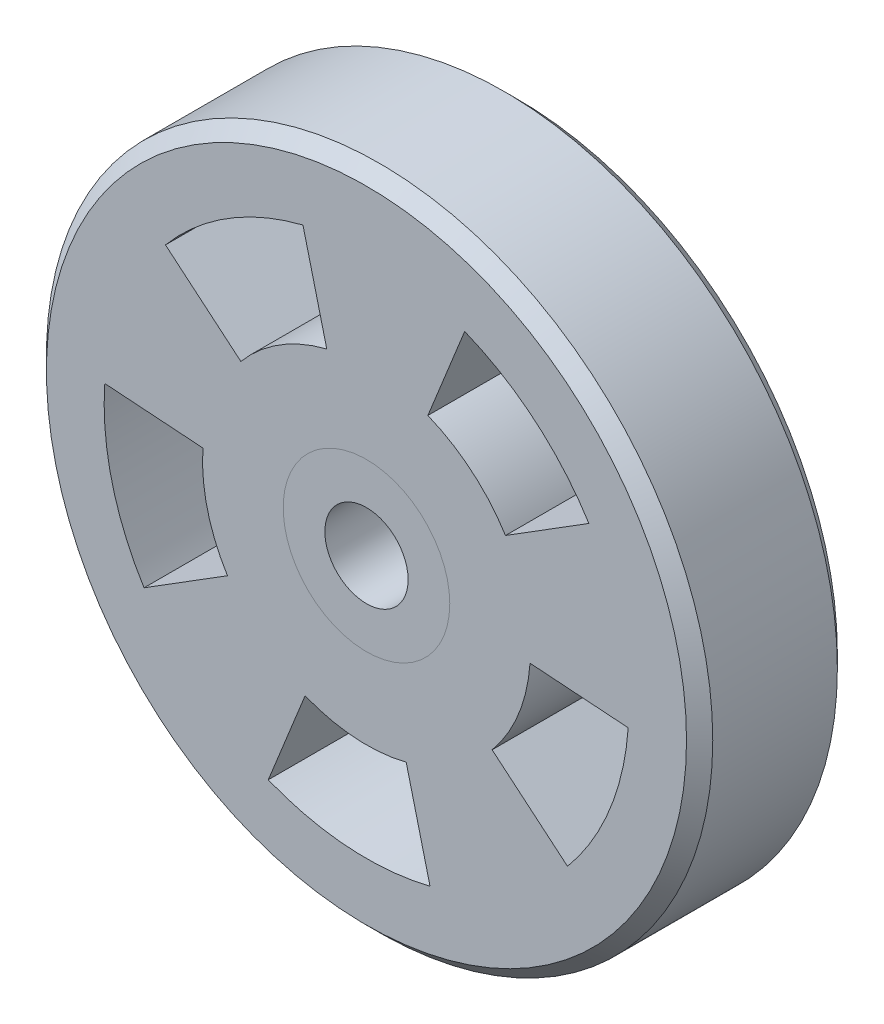
ISO-10303-21;
HEADER;
FILE_DESCRIPTION(('STEP AP214'),'2;1');
FILE_NAME('part.step','',(''),(''),'','','');
FILE_SCHEMA(('AUTOMOTIVE_DESIGN { 1 0 10303 214 1 1 1 1 }'));
ENDSEC;
DATA;
#1=APPLICATION_CONTEXT('core data for automotive mechanical design processes');
#2=APPLICATION_PROTOCOL_DEFINITION('international standard','automotive_design',2000,#1);
#3=PRODUCT_CONTEXT('',#1,'mechanical');
#4=PRODUCT('Part','Part','',(#3));
#5=PRODUCT_RELATED_PRODUCT_CATEGORY('part','',(#4));
#6=PRODUCT_DEFINITION_FORMATION('','',#4);
#7=PRODUCT_DEFINITION_CONTEXT('part definition',#1,'design');
#8=PRODUCT_DEFINITION('design','',#6,#7);
#9=PRODUCT_DEFINITION_SHAPE('','',#8);
#10=(LENGTH_UNIT() NAMED_UNIT(*) SI_UNIT(.MILLI.,.METRE.));
#11=(NAMED_UNIT(*) PLANE_ANGLE_UNIT() SI_UNIT($,.RADIAN.));
#12=(NAMED_UNIT(*) SI_UNIT($,.STERADIAN.) SOLID_ANGLE_UNIT());
#13=UNCERTAINTY_MEASURE_WITH_UNIT(LENGTH_MEASURE(1.E-05),#10,'distance_accuracy_value','');
#14=(GEOMETRIC_REPRESENTATION_CONTEXT(3) GLOBAL_UNCERTAINTY_ASSIGNED_CONTEXT((#13)) GLOBAL_UNIT_ASSIGNED_CONTEXT((#10,
#11,#12)) REPRESENTATION_CONTEXT('',''));
#15=CARTESIAN_POINT('',(0.,0.,0.));
#16=DIRECTION('',(0.,0.,1.));
#17=DIRECTION('',(1.,0.,0.));
#18=AXIS2_PLACEMENT_3D('',#15,#16,#17);
#19=CARTESIAN_POINT('',(0.,0.,-35.9210244842766));
#20=DIRECTION('',(0.,0.,1.));
#21=DIRECTION('',(1.,0.,0.));
#22=AXIS2_PLACEMENT_3D('',#19,#20,#21);
#23=CYLINDRICAL_SURFACE('',#22,12.7);
#24=CARTESIAN_POINT('',(0.,0.,0.));
#25=DIRECTION('',(0.,0.,1.));
#26=DIRECTION('',(1.,0.,0.));
#27=AXIS2_PLACEMENT_3D('',#24,#25,#26);
#28=CIRCLE('',#27,12.7);
#29=CARTESIAN_POINT('',(12.7,0.,0.));
#30=VERTEX_POINT('',#29);
#31=EDGE_CURVE('E11',#30,#30,#28,.F.);
#32=CARTESIAN_POINT('',(0.,0.,23.));
#33=DIRECTION('',(0.,0.,1.));
#34=DIRECTION('',(1.,0.,0.));
#35=AXIS2_PLACEMENT_3D('',#32,#33,#34);
#36=CIRCLE('',#35,12.7);
#37=CARTESIAN_POINT('',(12.7,0.,23.));
#38=VERTEX_POINT('',#37);
#39=EDGE_CURVE('E64',#38,#38,#36,.T.);
#40=CARTESIAN_POINT('',(12.7,0.,0.));
#41=CARTESIAN_POINT('',(12.7,0.,0.239583333333325));
#42=CARTESIAN_POINT('',(12.7,0.,0.479166666666658));
#43=CARTESIAN_POINT('',(12.7,0.,0.958333333333325));
#44=CARTESIAN_POINT('',(12.7,0.,1.19791666666666));
#45=CARTESIAN_POINT('',(12.7,0.,1.67708333333333));
#46=CARTESIAN_POINT('',(12.7,0.,1.91666666666666));
#47=CARTESIAN_POINT('',(12.7,0.,2.39583333333333));
#48=CARTESIAN_POINT('',(12.7,0.,2.63541666666666));
#49=CARTESIAN_POINT('',(12.7,0.,3.11458333333333));
#50=CARTESIAN_POINT('',(12.7,0.,3.35416666666666));
#51=CARTESIAN_POINT('',(12.7,0.,3.83333333333333));
#52=CARTESIAN_POINT('',(12.7,0.,4.07291666666666));
#53=CARTESIAN_POINT('',(12.7,0.,4.55208333333333));
#54=CARTESIAN_POINT('',(12.7,0.,4.79166666666666));
#55=CARTESIAN_POINT('',(12.7,0.,5.27083333333333));
#56=CARTESIAN_POINT('',(12.7,0.,5.51041666666666));
#57=CARTESIAN_POINT('',(12.7,0.,5.98958333333333));
#58=CARTESIAN_POINT('',(12.7,0.,6.22916666666666));
#59=CARTESIAN_POINT('',(12.7,0.,6.70833333333333));
#60=CARTESIAN_POINT('',(12.7,0.,6.94791666666666));
#61=CARTESIAN_POINT('',(12.7,0.,7.42708333333333));
#62=CARTESIAN_POINT('',(12.7,0.,7.66666666666666));
#63=CARTESIAN_POINT('',(12.7,0.,8.14583333333333));
#64=CARTESIAN_POINT('',(12.7,0.,8.38541666666666));
#65=CARTESIAN_POINT('',(12.7,0.,8.86458333333333));
#66=CARTESIAN_POINT('',(12.7,0.,9.10416666666666));
#67=CARTESIAN_POINT('',(12.7,0.,9.58333333333333));
#68=CARTESIAN_POINT('',(12.7,0.,9.82291666666666));
#69=CARTESIAN_POINT('',(12.7,0.,10.3020833333333));
#70=CARTESIAN_POINT('',(12.7,0.,10.5416666666667));
#71=CARTESIAN_POINT('',(12.7,0.,11.0208333333333));
#72=CARTESIAN_POINT('',(12.7,0.,11.2604166666667));
#73=CARTESIAN_POINT('',(12.7,0.,11.7395833333333));
#74=CARTESIAN_POINT('',(12.7,0.,11.9791666666667));
#75=CARTESIAN_POINT('',(12.7,0.,12.4583333333333));
#76=CARTESIAN_POINT('',(12.7,0.,12.6979166666667));
#77=CARTESIAN_POINT('',(12.7,0.,13.1770833333333));
#78=CARTESIAN_POINT('',(12.7,0.,13.4166666666667));
#79=CARTESIAN_POINT('',(12.7,0.,13.8958333333333));
#80=CARTESIAN_POINT('',(12.7,0.,14.1354166666667));
#81=CARTESIAN_POINT('',(12.7,0.,14.6145833333333));
#82=CARTESIAN_POINT('',(12.7,0.,14.8541666666667));
#83=CARTESIAN_POINT('',(12.7,0.,15.3333333333333));
#84=CARTESIAN_POINT('',(12.7,0.,15.5729166666667));
#85=CARTESIAN_POINT('',(12.7,0.,16.0520833333333));
#86=CARTESIAN_POINT('',(12.7,0.,16.2916666666667));
#87=CARTESIAN_POINT('',(12.7,0.,16.7708333333333));
#88=CARTESIAN_POINT('',(12.7,0.,17.0104166666667));
#89=CARTESIAN_POINT('',(12.7,0.,17.4895833333333));
#90=CARTESIAN_POINT('',(12.7,0.,17.7291666666667));
#91=CARTESIAN_POINT('',(12.7,0.,18.2083333333333));
#92=CARTESIAN_POINT('',(12.7,0.,18.4479166666667));
#93=CARTESIAN_POINT('',(12.7,0.,18.9270833333333));
#94=CARTESIAN_POINT('',(12.7,0.,19.1666666666667));
#95=CARTESIAN_POINT('',(12.7,0.,19.6458333333333));
#96=CARTESIAN_POINT('',(12.7,0.,19.8854166666667));
#97=CARTESIAN_POINT('',(12.7,0.,20.3645833333333));
#98=CARTESIAN_POINT('',(12.7,0.,20.6041666666667));
#99=CARTESIAN_POINT('',(12.7,0.,21.0833333333333));
#100=CARTESIAN_POINT('',(12.7,0.,21.3229166666667));
#101=CARTESIAN_POINT('',(12.7,0.,21.8020833333333));
#102=CARTESIAN_POINT('',(12.7,0.,22.0416666666667));
#103=CARTESIAN_POINT('',(12.7,0.,22.5208333333333));
#104=CARTESIAN_POINT('',(12.7,0.,22.7604166666667));
#105=CARTESIAN_POINT('',(12.7,0.,23.));
#106=B_SPLINE_CURVE_WITH_KNOTS('',3,(#40,#41,#42,#43,#44,#45,#46,#47,#48,#49,#50,#51,#52,#53,
#54,#55,#56,#57,#58,#59,#60,#61,#62,#63,#64,#65,#66,#67,#68,#69,#70,#71,#72,#73,#74,#75,#76,#77,
#78,#79,#80,#81,#82,#83,#84,#85,#86,#87,#88,#89,#90,#91,#92,#93,#94,#95,#96,#97,#98,#99,#100,
#101,#102,#103,#104,#105),.UNSPECIFIED.,.F.,.F.,(4,2,2,2,2,2,2,2,2,2,2,2,2,2,2,2,2,2,2,2,2,2,2,
2,2,2,2,2,2,2,2,2,4),(0.,0.718749999999997,1.4375,2.15625,2.875,3.59375,4.3125,5.03125,
5.75000000000001,6.46875,7.1875,7.90625,8.625,9.34375000000001,10.0625,10.78125,11.5,12.21875,
12.9375,13.65625,14.375,15.09375,15.8125,16.53125,17.25,17.96875,18.6875,19.40625,20.125,
20.84375,21.5625,22.28125,23.),.UNSPECIFIED.);
#107=EDGE_CURVE('BSEAM53',#30,#38,#106,.T.);
#108=ORIENTED_EDGE('',*,*,#31,.F.);
#109=ORIENTED_EDGE('',*,*,#39,.F.);
#110=ORIENTED_EDGE('',*,*,#107,.T.);
#111=ORIENTED_EDGE('',*,*,#107,.F.);
#112=EDGE_LOOP('',(#108,#110,#109,#111));
#113=FACE_BOUND('',#112,.T.);
#114=ADVANCED_FACE('F53',(#113),#23,.T.);
#115=CARTESIAN_POINT('',(0.,0.,23.));
#116=DIRECTION('',(0.,0.,1.));
#117=DIRECTION('',(1.,0.,0.));
#118=AXIS2_PLACEMENT_3D('',#115,#116,#117);
#119=PLANE('',#118);
#120=CARTESIAN_POINT('',(0.,0.,23.));
#121=DIRECTION('',(0.,0.,1.));
#122=DIRECTION('',(1.,0.,0.));
#123=AXIS2_PLACEMENT_3D('',#120,#121,#122);
#124=CIRCLE('',#123,6.35);
#125=CARTESIAN_POINT('',(6.35,0.,23.));
#126=VERTEX_POINT('',#125);
#127=EDGE_CURVE('E66',#126,#126,#124,.T.);
#128=ORIENTED_EDGE('',*,*,#127,.F.);
#129=EDGE_LOOP('',(#128));
#130=FACE_BOUND('',#129,.T.);
#131=ORIENTED_EDGE('',*,*,#39,.T.);
#132=EDGE_LOOP('',(#131));
#133=FACE_BOUND('',#132,.T.);
#134=ADVANCED_FACE('F71',(#130,#133),#119,.T.);
#135=CARTESIAN_POINT('',(0.,0.,-35.9210244842766));
#136=DIRECTION('',(0.,0.,1.));
#137=DIRECTION('',(1.,0.,0.));
#138=AXIS2_PLACEMENT_3D('',#135,#136,#137);
#139=CYLINDRICAL_SURFACE('',#138,6.35);
#140=CARTESIAN_POINT('',(0.,0.,0.));
#141=DIRECTION('',(0.,0.,1.));
#142=DIRECTION('',(1.,0.,0.));
#143=AXIS2_PLACEMENT_3D('',#140,#141,#142);
#144=CIRCLE('',#143,6.35);
#145=CARTESIAN_POINT('',(6.35,0.,0.));
#146=VERTEX_POINT('',#145);
#147=EDGE_CURVE('E56',#146,#146,#144,.F.);
#148=CARTESIAN_POINT('',(6.35,0.,0.));
#149=CARTESIAN_POINT('',(6.35,0.,0.239583333333325));
#150=CARTESIAN_POINT('',(6.35,0.,0.479166666666658));
#151=CARTESIAN_POINT('',(6.35,0.,0.958333333333325));
#152=CARTESIAN_POINT('',(6.35,0.,1.19791666666666));
#153=CARTESIAN_POINT('',(6.35,0.,1.67708333333333));
#154=CARTESIAN_POINT('',(6.35,0.,1.91666666666666));
#155=CARTESIAN_POINT('',(6.35,0.,2.39583333333333));
#156=CARTESIAN_POINT('',(6.35,0.,2.63541666666666));
#157=CARTESIAN_POINT('',(6.35,0.,3.11458333333333));
#158=CARTESIAN_POINT('',(6.35,0.,3.35416666666666));
#159=CARTESIAN_POINT('',(6.35,0.,3.83333333333333));
#160=CARTESIAN_POINT('',(6.35,0.,4.07291666666666));
#161=CARTESIAN_POINT('',(6.35,0.,4.55208333333333));
#162=CARTESIAN_POINT('',(6.35,0.,4.79166666666666));
#163=CARTESIAN_POINT('',(6.35,0.,5.27083333333333));
#164=CARTESIAN_POINT('',(6.35,0.,5.51041666666666));
#165=CARTESIAN_POINT('',(6.35,0.,5.98958333333333));
#166=CARTESIAN_POINT('',(6.35,0.,6.22916666666666));
#167=CARTESIAN_POINT('',(6.35,0.,6.70833333333333));
#168=CARTESIAN_POINT('',(6.35,0.,6.94791666666666));
#169=CARTESIAN_POINT('',(6.35,0.,7.42708333333333));
#170=CARTESIAN_POINT('',(6.35,0.,7.66666666666666));
#171=CARTESIAN_POINT('',(6.35,0.,8.14583333333333));
#172=CARTESIAN_POINT('',(6.35,0.,8.38541666666666));
#173=CARTESIAN_POINT('',(6.35,0.,8.86458333333333));
#174=CARTESIAN_POINT('',(6.35,0.,9.10416666666666));
#175=CARTESIAN_POINT('',(6.35,0.,9.58333333333333));
#176=CARTESIAN_POINT('',(6.35,0.,9.82291666666666));
#177=CARTESIAN_POINT('',(6.35,0.,10.3020833333333));
#178=CARTESIAN_POINT('',(6.35,0.,10.5416666666667));
#179=CARTESIAN_POINT('',(6.35,0.,11.0208333333333));
#180=CARTESIAN_POINT('',(6.35,0.,11.2604166666667));
#181=CARTESIAN_POINT('',(6.35,0.,11.7395833333333));
#182=CARTESIAN_POINT('',(6.35,0.,11.9791666666667));
#183=CARTESIAN_POINT('',(6.35,0.,12.4583333333333));
#184=CARTESIAN_POINT('',(6.35,0.,12.6979166666667));
#185=CARTESIAN_POINT('',(6.35,0.,13.1770833333333));
#186=CARTESIAN_POINT('',(6.35,0.,13.4166666666667));
#187=CARTESIAN_POINT('',(6.35,0.,13.8958333333333));
#188=CARTESIAN_POINT('',(6.35,0.,14.1354166666667));
#189=CARTESIAN_POINT('',(6.35,0.,14.6145833333333));
#190=CARTESIAN_POINT('',(6.35,0.,14.8541666666667));
#191=CARTESIAN_POINT('',(6.35,0.,15.3333333333333));
#192=CARTESIAN_POINT('',(6.35,0.,15.5729166666667));
#193=CARTESIAN_POINT('',(6.35,0.,16.0520833333333));
#194=CARTESIAN_POINT('',(6.35,0.,16.2916666666667));
#195=CARTESIAN_POINT('',(6.35,0.,16.7708333333333));
#196=CARTESIAN_POINT('',(6.35,0.,17.0104166666667));
#197=CARTESIAN_POINT('',(6.35,0.,17.4895833333333));
#198=CARTESIAN_POINT('',(6.35,0.,17.7291666666667));
#199=CARTESIAN_POINT('',(6.35,0.,18.2083333333333));
#200=CARTESIAN_POINT('',(6.35,0.,18.4479166666667));
#201=CARTESIAN_POINT('',(6.35,0.,18.9270833333333));
#202=CARTESIAN_POINT('',(6.35,0.,19.1666666666667));
#203=CARTESIAN_POINT('',(6.35,0.,19.6458333333333));
#204=CARTESIAN_POINT('',(6.35,0.,19.8854166666667));
#205=CARTESIAN_POINT('',(6.35,0.,20.3645833333333));
#206=CARTESIAN_POINT('',(6.35,0.,20.6041666666667));
#207=CARTESIAN_POINT('',(6.35,0.,21.0833333333333));
#208=CARTESIAN_POINT('',(6.35,0.,21.3229166666667));
#209=CARTESIAN_POINT('',(6.35,0.,21.8020833333333));
#210=CARTESIAN_POINT('',(6.35,0.,22.0416666666667));
#211=CARTESIAN_POINT('',(6.35,0.,22.5208333333333));
#212=CARTESIAN_POINT('',(6.35,0.,22.7604166666667));
#213=CARTESIAN_POINT('',(6.35,0.,23.));
#214=B_SPLINE_CURVE_WITH_KNOTS('',3,(#148,#149,#150,#151,#152,#153,#154,#155,#156,#157,#158,
#159,#160,#161,#162,#163,#164,#165,#166,#167,#168,#169,#170,#171,#172,#173,#174,#175,#176,#177,
#178,#179,#180,#181,#182,#183,#184,#185,#186,#187,#188,#189,#190,#191,#192,#193,#194,#195,#196,
#197,#198,#199,#200,#201,#202,#203,#204,#205,#206,#207,#208,#209,#210,#211,#212,#213),
.UNSPECIFIED.,.F.,.F.,(4,2,2,2,2,2,2,2,2,2,2,2,2,2,2,2,2,2,2,2,2,2,2,2,2,2,2,2,2,2,2,2,4),(0.,
0.718749999999997,1.4375,2.15625,2.875,3.59375,4.3125,5.03125,5.75000000000001,6.46875,7.1875,
7.90625,8.625,9.34375000000001,10.0625,10.78125,11.5,12.21875,12.9375,13.65625,14.375,15.09375,
15.8125,16.53125,17.25,17.96875,18.6875,19.40625,20.125,20.84375,21.5625,22.28125,23.),.UNSPECIFIED.);
#215=EDGE_CURVE('BSEAM78',#146,#126,#214,.T.);
#216=ORIENTED_EDGE('',*,*,#147,.T.);
#217=ORIENTED_EDGE('',*,*,#127,.T.);
#218=ORIENTED_EDGE('',*,*,#215,.T.);
#219=ORIENTED_EDGE('',*,*,#215,.F.);
#220=EDGE_LOOP('',(#216,#218,#217,#219));
#221=FACE_BOUND('',#220,.T.);
#222=ADVANCED_FACE('F78',(#221),#139,.F.);
#223=CARTESIAN_POINT('',(0.,0.,0.));
#224=DIRECTION('',(0.,0.,1.));
#225=DIRECTION('',(1.,0.,0.));
#226=AXIS2_PLACEMENT_3D('',#223,#224,#225);
#227=PLANE('',#226);
#228=ORIENTED_EDGE('',*,*,#31,.T.);
#229=EDGE_LOOP('',(#228));
#230=FACE_BOUND('',#229,.T.);
#231=ORIENTED_EDGE('',*,*,#147,.F.);
#232=EDGE_LOOP('',(#231));
#233=FACE_BOUND('',#232,.T.);
#234=ADVANCED_FACE('F83',(#230,#233),#227,.F.);
#235=CLOSED_SHELL('',(#114,#134,#222,#234));
#236=MANIFOLD_SOLID_BREP('B2',#235);
#237=CARTESIAN_POINT('',(0.,0.,23.));
#238=DIRECTION('',(0.,0.,-1.));
#239=DIRECTION('',(-1.,0.,0.));
#240=AXIS2_PLACEMENT_3D('',#237,#238,#239);
#241=CYLINDRICAL_SURFACE('',#240,40.);
#242=CARTESIAN_POINT('',(0.,0.,0.));
#243=DIRECTION('',(0.,0.,1.));
#244=DIRECTION('',(1.,0.,0.));
#245=AXIS2_PLACEMENT_3D('',#242,#243,#244);
#246=CIRCLE('',#245,40.);
#247=CARTESIAN_POINT('',(-39.9033728709344,2.77863878961923,0.));
#248=VERTEX_POINT('',#247);
#249=CARTESIAN_POINT('',(-33.9157496874521,-21.2066480882315,0.));
#250=VERTEX_POINT('',#249);
#251=EDGE_CURVE('E360',#248,#250,#246,.T.);
#252=ORIENTED_EDGE('',*,*,#251,.F.);
#253=DIRECTION('',(0.,0.,-1.));
#254=VECTOR('',#253,1.);
#255=CARTESIAN_POINT('',(-39.9033728709344,2.77863878961923,23.));
#256=LINE('',#255,#254);
#257=CARTESIAN_POINT('',(-39.9033728709344,2.77863878961923,23.));
#258=VERTEX_POINT('',#257);
#259=EDGE_CURVE('E282',#258,#248,#256,.T.);
#260=ORIENTED_EDGE('',*,*,#259,.F.);
#261=CARTESIAN_POINT('',(0.,0.,23.));
#262=DIRECTION('',(0.,0.,1.));
#263=DIRECTION('',(1.,0.,0.));
#264=AXIS2_PLACEMENT_3D('',#261,#262,#263);
#265=CIRCLE('',#264,40.);
#266=CARTESIAN_POINT('',(-33.9157496874521,-21.2066480882315,23.));
#267=VERTEX_POINT('',#266);
#268=EDGE_CURVE('E269',#258,#267,#265,.T.);
#269=ORIENTED_EDGE('',*,*,#268,.T.);
#270=DIRECTION('',(0.,0.,-1.));
#271=VECTOR('',#270,1.);
#272=CARTESIAN_POINT('',(-33.9157496874521,-21.2066480882315,23.));
#273=LINE('',#272,#271);
#274=EDGE_CURVE('E205',#267,#250,#273,.T.);
#275=ORIENTED_EDGE('',*,*,#274,.T.);
#276=EDGE_LOOP('',(#252,#260,#269,#275));
#277=FACE_BOUND('',#276,.T.);
#278=ADVANCED_FACE('F115',(#277),#241,.F.);
#279=CARTESIAN_POINT('',(0.,0.,23.));
#280=DIRECTION('',(0.0694659697404807,0.99758432177336,0.));
#281=DIRECTION('',(-0.99758432177336,0.0694659697404807,0.));
#282=AXIS2_PLACEMENT_3D('',#279,#280,#281);
#283=PLANE('',#282);
#284=DIRECTION('',(0.99758432177336,-0.0694659697404807,0.));
#285=VECTOR('',#284,1.);
#286=CARTESIAN_POINT('',(0.,0.,0.));
#287=LINE('',#286,#285);
#288=CARTESIAN_POINT('',(-24.939608044334,1.73664924351202,0.));
#289=VERTEX_POINT('',#288);
#290=EDGE_CURVE('E277',#248,#289,#287,.T.);
#291=ORIENTED_EDGE('',*,*,#290,.T.);
#292=DIRECTION('',(0.,0.,-1.));
#293=VECTOR('',#292,1.);
#294=CARTESIAN_POINT('',(-24.939608044334,1.73664924351202,23.));
#295=LINE('',#294,#293);
#296=CARTESIAN_POINT('',(-24.939608044334,1.73664924351202,23.));
#297=VERTEX_POINT('',#296);
#298=EDGE_CURVE('E274',#297,#289,#295,.T.);
#299=ORIENTED_EDGE('',*,*,#298,.F.);
#300=DIRECTION('',(0.99758432177336,-0.0694659697404807,0.));
#301=VECTOR('',#300,1.);
#302=CARTESIAN_POINT('',(0.,0.,23.));
#303=LINE('',#302,#301);
#304=EDGE_CURVE('E263',#258,#297,#303,.T.);
#305=ORIENTED_EDGE('',*,*,#304,.F.);
#306=ORIENTED_EDGE('',*,*,#259,.T.);
#307=EDGE_LOOP('',(#291,#299,#305,#306));
#308=FACE_BOUND('',#307,.T.);
#309=ADVANCED_FACE('F275',(#308),#283,.F.);
#310=CARTESIAN_POINT('',(0.,0.,23.));
#311=DIRECTION('',(0.,0.,-1.));
#312=DIRECTION('',(-1.,0.,0.));
#313=AXIS2_PLACEMENT_3D('',#310,#311,#312);
#314=CYLINDRICAL_SURFACE('',#313,25.);
#315=CARTESIAN_POINT('',(0.,0.,0.));
#316=DIRECTION('',(0.,0.,1.));
#317=DIRECTION('',(1.,0.,0.));
#318=AXIS2_PLACEMENT_3D('',#315,#316,#317);
#319=CIRCLE('',#318,25.);
#320=CARTESIAN_POINT('',(-21.1973435546576,-13.2541550551447,0.));
#321=VERTEX_POINT('',#320);
#322=EDGE_CURVE('E366',#321,#289,#319,.F.);
#323=ORIENTED_EDGE('',*,*,#322,.F.);
#324=DIRECTION('',(0.,0.,-1.));
#325=VECTOR('',#324,1.);
#326=CARTESIAN_POINT('',(-21.1973435546576,-13.2541550551447,23.));
#327=LINE('',#326,#325);
#328=CARTESIAN_POINT('',(-21.1973435546576,-13.2541550551447,23.));
#329=VERTEX_POINT('',#328);
#330=EDGE_CURVE('E198',#329,#321,#327,.T.);
#331=ORIENTED_EDGE('',*,*,#330,.F.);
#332=CARTESIAN_POINT('',(0.,0.,23.));
#333=DIRECTION('',(0.,0.,1.));
#334=DIRECTION('',(1.,0.,0.));
#335=AXIS2_PLACEMENT_3D('',#332,#333,#334);
#336=CIRCLE('',#335,25.);
#337=EDGE_CURVE('E268',#329,#297,#336,.F.);
#338=ORIENTED_EDGE('',*,*,#337,.T.);
#339=ORIENTED_EDGE('',*,*,#298,.T.);
#340=EDGE_LOOP('',(#323,#331,#338,#339));
#341=FACE_BOUND('',#340,.T.);
#342=ADVANCED_FACE('F284',(#341),#314,.T.);
#343=CARTESIAN_POINT('',(0.,0.,23.));
#344=DIRECTION('',(0.,0.,-1.));
#345=DIRECTION('',(-1.,0.,0.));
#346=AXIS2_PLACEMENT_3D('',#343,#344,#345);
#347=CYLINDRICAL_SURFACE('',#346,40.);
#348=CARTESIAN_POINT('',(0.,0.,0.));
#349=DIRECTION('',(0.,0.,1.));
#350=DIRECTION('',(1.,0.,0.));
#351=AXIS2_PLACEMENT_3D('',#348,#349,#350);
#352=CIRCLE('',#351,40.);
#353=CARTESIAN_POINT('',(-9.68817782270101,38.8090093982792,0.));
#354=VERTEX_POINT('',#353);
#355=CARTESIAN_POINT('',(-30.6492638834802,25.7025800922942,0.));
#356=VERTEX_POINT('',#355);
#357=EDGE_CURVE('E344',#354,#356,#352,.T.);
#358=ORIENTED_EDGE('',*,*,#357,.F.);
#359=DIRECTION('',(0.,0.,-1.));
#360=VECTOR('',#359,1.);
#361=CARTESIAN_POINT('',(-9.68817782270101,38.8090093982792,23.));
#362=LINE('',#361,#360);
#363=CARTESIAN_POINT('',(-9.68817782270101,38.8090093982792,23.));
#364=VERTEX_POINT('',#363);
#365=EDGE_CURVE('E379',#364,#354,#362,.T.);
#366=ORIENTED_EDGE('',*,*,#365,.F.);
#367=CARTESIAN_POINT('',(0.,0.,23.));
#368=DIRECTION('',(0.,0.,1.));
#369=DIRECTION('',(1.,0.,0.));
#370=AXIS2_PLACEMENT_3D('',#367,#368,#369);
#371=CIRCLE('',#370,40.);
#372=CARTESIAN_POINT('',(-30.6492638834802,25.7025800922942,23.));
#373=VERTEX_POINT('',#372);
#374=EDGE_CURVE('E474',#364,#373,#371,.T.);
#375=ORIENTED_EDGE('',*,*,#374,.T.);
#376=DIRECTION('',(0.,0.,-1.));
#377=VECTOR('',#376,1.);
#378=CARTESIAN_POINT('',(-30.6492638834802,25.7025800922942,23.));
#379=LINE('',#378,#377);
#380=EDGE_CURVE('E385',#373,#356,#379,.T.);
#381=ORIENTED_EDGE('',*,*,#380,.T.);
#382=EDGE_LOOP('',(#358,#366,#375,#381));
#383=FACE_BOUND('',#382,.T.);
#384=ADVANCED_FACE('F532',(#383),#347,.F.);
#385=CARTESIAN_POINT('',(0.,0.,23.));
#386=DIRECTION('',(0.97022523495698,0.242204445567525,0.));
#387=DIRECTION('',(-0.242204445567525,0.97022523495698,0.));
#388=AXIS2_PLACEMENT_3D('',#385,#386,#387);
#389=PLANE('',#388);
#390=DIRECTION('',(0.242204445567525,-0.97022523495698,0.));
#391=VECTOR('',#390,1.);
#392=CARTESIAN_POINT('',(0.,0.,0.));
#393=LINE('',#392,#391);
#394=CARTESIAN_POINT('',(-6.05511113918813,24.2556308739245,0.));
#395=VERTEX_POINT('',#394);
#396=EDGE_CURVE('E348',#354,#395,#393,.T.);
#397=ORIENTED_EDGE('',*,*,#396,.T.);
#398=DIRECTION('',(0.,0.,-1.));
#399=VECTOR('',#398,1.);
#400=CARTESIAN_POINT('',(-6.05511113918813,24.2556308739245,23.));
#401=LINE('',#400,#399);
#402=CARTESIAN_POINT('',(-6.05511113918813,24.2556308739245,23.));
#403=VERTEX_POINT('',#402);
#404=EDGE_CURVE('E392',#403,#395,#401,.T.);
#405=ORIENTED_EDGE('',*,*,#404,.F.);
#406=DIRECTION('',(0.242204445567525,-0.97022523495698,0.));
#407=VECTOR('',#406,1.);
#408=CARTESIAN_POINT('',(0.,0.,23.));
#409=LINE('',#408,#407);
#410=EDGE_CURVE('E477',#364,#403,#409,.T.);
#411=ORIENTED_EDGE('',*,*,#410,.F.);
#412=ORIENTED_EDGE('',*,*,#365,.T.);
#413=EDGE_LOOP('',(#397,#405,#411,#412));
#414=FACE_BOUND('',#413,.T.);
#415=ADVANCED_FACE('F528',(#414),#389,.F.);
#416=CARTESIAN_POINT('',(0.,0.,23.));
#417=DIRECTION('',(0.,0.,-1.));
#418=DIRECTION('',(-1.,0.,0.));
#419=AXIS2_PLACEMENT_3D('',#416,#417,#418);
#420=CYLINDRICAL_SURFACE('',#419,25.);
#421=CARTESIAN_POINT('',(0.,0.,0.));
#422=DIRECTION('',(0.,0.,1.));
#423=DIRECTION('',(1.,0.,0.));
#424=AXIS2_PLACEMENT_3D('',#421,#422,#423);
#425=CIRCLE('',#424,25.);
#426=CARTESIAN_POINT('',(-19.1557899271751,16.0641125576839,0.));
#427=VERTEX_POINT('',#426);
#428=EDGE_CURVE('E352',#427,#395,#425,.F.);
#429=ORIENTED_EDGE('',*,*,#428,.F.);
#430=DIRECTION('',(0.,0.,-1.));
#431=VECTOR('',#430,1.);
#432=CARTESIAN_POINT('',(-19.1557899271751,16.0641125576839,23.));
#433=LINE('',#432,#431);
#434=CARTESIAN_POINT('',(-19.1557899271751,16.0641125576839,23.));
#435=VERTEX_POINT('',#434);
#436=EDGE_CURVE('E388',#435,#427,#433,.T.);
#437=ORIENTED_EDGE('',*,*,#436,.F.);
#438=CARTESIAN_POINT('',(0.,0.,23.));
#439=DIRECTION('',(0.,0.,1.));
#440=DIRECTION('',(1.,0.,0.));
#441=AXIS2_PLACEMENT_3D('',#438,#439,#440);
#442=CIRCLE('',#441,25.);
#443=EDGE_CURVE('E488',#435,#403,#442,.F.);
#444=ORIENTED_EDGE('',*,*,#443,.T.);
#445=ORIENTED_EDGE('',*,*,#404,.T.);
#446=EDGE_LOOP('',(#429,#437,#444,#445));
#447=FACE_BOUND('',#446,.T.);
#448=ADVANCED_FACE('F524',(#447),#420,.T.);
#449=CARTESIAN_POINT('',(0.,0.,23.));
#450=DIRECTION('',(0.,0.,-1.));
#451=DIRECTION('',(-1.,0.,0.));
#452=AXIS2_PLACEMENT_3D('',#449,#450,#451);
#453=CYLINDRICAL_SURFACE('',#452,40.);
#454=CARTESIAN_POINT('',(0.,0.,0.));
#455=DIRECTION('',(0.,0.,1.));
#456=DIRECTION('',(1.,0.,0.));
#457=AXIS2_PLACEMENT_3D('',#454,#455,#456);
#458=CIRCLE('',#457,40.);
#459=CARTESIAN_POINT('',(33.9157496874523,21.2066480882312,0.));
#460=VERTEX_POINT('',#459);
#461=CARTESIAN_POINT('',(14.9734628772969,37.0917161838356,0.));
#462=VERTEX_POINT('',#461);
#463=EDGE_CURVE('E328',#460,#462,#458,.T.);
#464=ORIENTED_EDGE('',*,*,#463,.F.);
#465=DIRECTION('',(0.,0.,-1.));
#466=VECTOR('',#465,1.);
#467=CARTESIAN_POINT('',(33.9157496874523,21.2066480882312,23.));
#468=LINE('',#467,#466);
#469=CARTESIAN_POINT('',(33.9157496874523,21.2066480882312,23.));
#470=VERTEX_POINT('',#469);
#471=EDGE_CURVE('E389',#470,#460,#468,.T.);
#472=ORIENTED_EDGE('',*,*,#471,.F.);
#473=CARTESIAN_POINT('',(0.,0.,23.));
#474=DIRECTION('',(0.,0.,1.));
#475=DIRECTION('',(1.,0.,0.));
#476=AXIS2_PLACEMENT_3D('',#473,#474,#475);
#477=CIRCLE('',#476,40.);
#478=CARTESIAN_POINT('',(14.9734628772969,37.0917161838356,23.));
#479=VERTEX_POINT('',#478);
#480=EDGE_CURVE('E471',#470,#479,#477,.T.);
#481=ORIENTED_EDGE('',*,*,#480,.T.);
#482=DIRECTION('',(0.,0.,-1.));
#483=VECTOR('',#482,1.);
#484=CARTESIAN_POINT('',(14.9734628772969,37.0917161838356,23.));
#485=LINE('',#484,#483);
#486=EDGE_CURVE('E397',#479,#462,#485,.T.);
#487=ORIENTED_EDGE('',*,*,#486,.T.);
#488=EDGE_LOOP('',(#464,#472,#481,#487));
#489=FACE_BOUND('',#488,.T.);
#490=ADVANCED_FACE('F527',(#489),#453,.F.);
#491=CARTESIAN_POINT('',(0.,0.,23.));
#492=DIRECTION('',(0.53016620220578,-0.847893742186307,0.));
#493=DIRECTION('',(0.847893742186307,0.53016620220578,0.));
#494=AXIS2_PLACEMENT_3D('',#491,#492,#493);
#495=PLANE('',#494);
#496=DIRECTION('',(-0.847893742186307,-0.53016620220578,0.));
#497=VECTOR('',#496,1.);
#498=CARTESIAN_POINT('',(0.,0.,0.));
#499=LINE('',#498,#497);
#500=CARTESIAN_POINT('',(21.1973435546577,13.2541550551445,0.));
#501=VERTEX_POINT('',#500);
#502=EDGE_CURVE('E332',#460,#501,#499,.T.);
#503=ORIENTED_EDGE('',*,*,#502,.T.);
#504=DIRECTION('',(0.,0.,-1.));
#505=VECTOR('',#504,1.);
#506=CARTESIAN_POINT('',(21.1973435546577,13.2541550551445,23.));
#507=LINE('',#506,#505);
#508=CARTESIAN_POINT('',(21.1973435546577,13.2541550551445,23.));
#509=VERTEX_POINT('',#508);
#510=EDGE_CURVE('E404',#509,#501,#507,.T.);
#511=ORIENTED_EDGE('',*,*,#510,.F.);
#512=DIRECTION('',(-0.847893742186307,-0.53016620220578,0.));
#513=VECTOR('',#512,1.);
#514=CARTESIAN_POINT('',(0.,0.,23.));
#515=LINE('',#514,#513);
#516=EDGE_CURVE('E619',#470,#509,#515,.T.);
#517=ORIENTED_EDGE('',*,*,#516,.F.);
#518=ORIENTED_EDGE('',*,*,#471,.T.);
#519=EDGE_LOOP('',(#503,#511,#517,#518));
#520=FACE_BOUND('',#519,.T.);
#521=ADVANCED_FACE('F544',(#520),#495,.F.);
#522=CARTESIAN_POINT('',(0.,0.,23.));
#523=DIRECTION('',(0.,0.,-1.));
#524=DIRECTION('',(-1.,0.,0.));
#525=AXIS2_PLACEMENT_3D('',#522,#523,#524);
#526=CYLINDRICAL_SURFACE('',#525,25.);
#527=CARTESIAN_POINT('',(0.,0.,0.));
#528=DIRECTION('',(0.,0.,1.));
#529=DIRECTION('',(1.,0.,0.));
#530=AXIS2_PLACEMENT_3D('',#527,#528,#529);
#531=CIRCLE('',#530,25.);
#532=CARTESIAN_POINT('',(9.35841429831059,23.1823226148972,0.));
#533=VERTEX_POINT('',#532);
#534=EDGE_CURVE('E336',#533,#501,#531,.F.);
#535=ORIENTED_EDGE('',*,*,#534,.F.);
#536=DIRECTION('',(0.,0.,-1.));
#537=VECTOR('',#536,1.);
#538=CARTESIAN_POINT('',(9.35841429831059,23.1823226148972,23.));
#539=LINE('',#538,#537);
#540=CARTESIAN_POINT('',(9.35841429831059,23.1823226148972,23.));
#541=VERTEX_POINT('',#540);
#542=EDGE_CURVE('E400',#541,#533,#539,.T.);
#543=ORIENTED_EDGE('',*,*,#542,.F.);
#544=CARTESIAN_POINT('',(0.,0.,23.));
#545=DIRECTION('',(0.,0.,1.));
#546=DIRECTION('',(1.,0.,0.));
#547=AXIS2_PLACEMENT_3D('',#544,#545,#546);
#548=CIRCLE('',#547,25.);
#549=EDGE_CURVE('E490',#541,#509,#548,.F.);
#550=ORIENTED_EDGE('',*,*,#549,.T.);
#551=ORIENTED_EDGE('',*,*,#510,.T.);
#552=EDGE_LOOP('',(#535,#543,#550,#551));
#553=FACE_BOUND('',#552,.T.);
#554=ADVANCED_FACE('F540',(#553),#526,.T.);
#555=CARTESIAN_POINT('',(0.,0.,23.));
#556=DIRECTION('',(0.,0.,-1.));
#557=DIRECTION('',(-1.,0.,0.));
#558=AXIS2_PLACEMENT_3D('',#555,#556,#557);
#559=CYLINDRICAL_SURFACE('',#558,40.);
#560=CARTESIAN_POINT('',(0.,0.,0.));
#561=DIRECTION('',(0.,0.,1.));
#562=DIRECTION('',(1.,0.,0.));
#563=AXIS2_PLACEMENT_3D('',#560,#561,#562);
#564=CIRCLE('',#563,40.);
#565=CARTESIAN_POINT('',(30.64926388348,-25.7025800922945,0.));
#566=VERTEX_POINT('',#565);
#567=CARTESIAN_POINT('',(39.9033728709344,-2.7786387896195,0.));
#568=VERTEX_POINT('',#567);
#569=EDGE_CURVE('E312',#566,#568,#564,.T.);
#570=ORIENTED_EDGE('',*,*,#569,.F.);
#571=DIRECTION('',(0.,0.,-1.));
#572=VECTOR('',#571,1.);
#573=CARTESIAN_POINT('',(30.64926388348,-25.7025800922945,23.));
#574=LINE('',#573,#572);
#575=CARTESIAN_POINT('',(30.64926388348,-25.7025800922945,23.));
#576=VERTEX_POINT('',#575);
#577=EDGE_CURVE('E401',#576,#566,#574,.T.);
#578=ORIENTED_EDGE('',*,*,#577,.F.);
#579=CARTESIAN_POINT('',(0.,0.,23.));
#580=DIRECTION('',(0.,0.,1.));
#581=DIRECTION('',(1.,0.,0.));
#582=AXIS2_PLACEMENT_3D('',#579,#580,#581);
#583=CIRCLE('',#582,40.);
#584=CARTESIAN_POINT('',(39.9033728709344,-2.7786387896195,23.));
#585=VERTEX_POINT('',#584);
#586=EDGE_CURVE('E467',#576,#585,#583,.T.);
#587=ORIENTED_EDGE('',*,*,#586,.T.);
#588=DIRECTION('',(0.,0.,-1.));
#589=VECTOR('',#588,1.);
#590=CARTESIAN_POINT('',(39.9033728709344,-2.7786387896195,23.));
#591=LINE('',#590,#589);
#592=EDGE_CURVE('E409',#585,#568,#591,.T.);
#593=ORIENTED_EDGE('',*,*,#592,.T.);
#594=EDGE_LOOP('',(#570,#578,#587,#593));
#595=FACE_BOUND('',#594,.T.);
#596=ADVANCED_FACE('F543',(#595),#559,.F.);
#597=CARTESIAN_POINT('',(0.,0.,23.));
#598=DIRECTION('',(-0.642564502307362,-0.766231597086999,0.));
#599=DIRECTION('',(0.766231597086999,-0.642564502307362,0.));
#600=AXIS2_PLACEMENT_3D('',#597,#598,#599);
#601=PLANE('',#600);
#602=DIRECTION('',(-0.766231597086999,0.642564502307362,0.));
#603=VECTOR('',#602,1.);
#604=CARTESIAN_POINT('',(0.,0.,0.));
#605=LINE('',#604,#603);
#606=CARTESIAN_POINT('',(19.155789927175,-16.064112557684,0.));
#607=VERTEX_POINT('',#606);
#608=EDGE_CURVE('E316',#566,#607,#605,.T.);
#609=ORIENTED_EDGE('',*,*,#608,.T.);
#610=DIRECTION('',(0.,0.,-1.));
#611=VECTOR('',#610,1.);
#612=CARTESIAN_POINT('',(19.155789927175,-16.064112557684,23.));
#613=LINE('',#612,#611);
#614=CARTESIAN_POINT('',(19.155789927175,-16.064112557684,23.));
#615=VERTEX_POINT('',#614);
#616=EDGE_CURVE('E415',#615,#607,#613,.T.);
#617=ORIENTED_EDGE('',*,*,#616,.F.);
#618=DIRECTION('',(-0.766231597086999,0.642564502307362,0.));
#619=VECTOR('',#618,1.);
#620=CARTESIAN_POINT('',(0.,0.,23.));
#621=LINE('',#620,#619);
#622=EDGE_CURVE('E607',#576,#615,#621,.T.);
#623=ORIENTED_EDGE('',*,*,#622,.F.);
#624=ORIENTED_EDGE('',*,*,#577,.T.);
#625=EDGE_LOOP('',(#609,#617,#623,#624));
#626=FACE_BOUND('',#625,.T.);
#627=ADVANCED_FACE('F559',(#626),#601,.F.);
#628=CARTESIAN_POINT('',(0.,0.,23.));
#629=DIRECTION('',(0.,0.,-1.));
#630=DIRECTION('',(-1.,0.,0.));
#631=AXIS2_PLACEMENT_3D('',#628,#629,#630);
#632=CYLINDRICAL_SURFACE('',#631,25.);
#633=CARTESIAN_POINT('',(0.,0.,0.));
#634=DIRECTION('',(0.,0.,1.));
#635=DIRECTION('',(1.,0.,0.));
#636=AXIS2_PLACEMENT_3D('',#633,#634,#635);
#637=CIRCLE('',#636,25.);
#638=CARTESIAN_POINT('',(24.939608044334,-1.73664924351218,0.));
#639=VERTEX_POINT('',#638);
#640=EDGE_CURVE('E320',#639,#607,#637,.F.);
#641=ORIENTED_EDGE('',*,*,#640,.F.);
#642=DIRECTION('',(0.,0.,-1.));
#643=VECTOR('',#642,1.);
#644=CARTESIAN_POINT('',(24.939608044334,-1.73664924351218,23.));
#645=LINE('',#644,#643);
#646=CARTESIAN_POINT('',(24.939608044334,-1.73664924351218,23.));
#647=VERTEX_POINT('',#646);
#648=EDGE_CURVE('E412',#647,#639,#645,.T.);
#649=ORIENTED_EDGE('',*,*,#648,.F.);
#650=CARTESIAN_POINT('',(0.,0.,23.));
#651=DIRECTION('',(0.,0.,1.));
#652=DIRECTION('',(1.,0.,0.));
#653=AXIS2_PLACEMENT_3D('',#650,#651,#652);
#654=CIRCLE('',#653,25.);
#655=EDGE_CURVE('E610',#647,#615,#654,.F.);
#656=ORIENTED_EDGE('',*,*,#655,.T.);
#657=ORIENTED_EDGE('',*,*,#616,.T.);
#658=EDGE_LOOP('',(#641,#649,#656,#657));
#659=FACE_BOUND('',#658,.T.);
#660=ADVANCED_FACE('F555',(#659),#632,.T.);
#661=CARTESIAN_POINT('',(0.,0.,23.));
#662=DIRECTION('',(0.,0.,-1.));
#663=DIRECTION('',(-1.,0.,0.));
#664=AXIS2_PLACEMENT_3D('',#661,#662,#663);
#665=CYLINDRICAL_SURFACE('',#664,40.);
#666=CARTESIAN_POINT('',(0.,0.,0.));
#667=DIRECTION('',(0.,0.,1.));
#668=DIRECTION('',(1.,0.,0.));
#669=AXIS2_PLACEMENT_3D('',#666,#667,#668);
#670=CIRCLE('',#669,40.);
#671=CARTESIAN_POINT('',(-14.9734628772972,-37.0917161838355,0.));
#672=VERTEX_POINT('',#671);
#673=CARTESIAN_POINT('',(9.68817782270076,-38.8090093982793,0.));
#674=VERTEX_POINT('',#673);
#675=EDGE_CURVE('E296',#672,#674,#670,.T.);
#676=ORIENTED_EDGE('',*,*,#675,.F.);
#677=DIRECTION('',(0.,0.,-1.));
#678=VECTOR('',#677,1.);
#679=CARTESIAN_POINT('',(-14.9734628772972,-37.0917161838355,23.));
#680=LINE('',#679,#678);
#681=CARTESIAN_POINT('',(-14.9734628772972,-37.0917161838355,23.));
#682=VERTEX_POINT('',#681);
#683=EDGE_CURVE('E212',#682,#672,#680,.T.);
#684=ORIENTED_EDGE('',*,*,#683,.F.);
#685=CARTESIAN_POINT('',(0.,0.,23.));
#686=DIRECTION('',(0.,0.,1.));
#687=DIRECTION('',(1.,0.,0.));
#688=AXIS2_PLACEMENT_3D('',#685,#686,#687);
#689=CIRCLE('',#688,40.);
#690=CARTESIAN_POINT('',(9.68817782270076,-38.8090093982793,23.));
#691=VERTEX_POINT('',#690);
#692=EDGE_CURVE('E376',#682,#691,#689,.T.);
#693=ORIENTED_EDGE('',*,*,#692,.T.);
#694=DIRECTION('',(0.,0.,-1.));
#695=VECTOR('',#694,1.);
#696=CARTESIAN_POINT('',(9.68817782270076,-38.8090093982793,23.));
#697=LINE('',#696,#695);
#698=EDGE_CURVE('E295',#691,#674,#697,.T.);
#699=ORIENTED_EDGE('',*,*,#698,.T.);
#700=EDGE_LOOP('',(#676,#684,#693,#699));
#701=FACE_BOUND('',#700,.T.);
#702=ADVANCED_FACE('F558',(#701),#665,.F.);
#703=CARTESIAN_POINT('',(0.,0.,23.));
#704=DIRECTION('',(-0.927292904595886,0.374336571932431,0.));
#705=DIRECTION('',(-0.374336571932431,-0.927292904595887,0.));
#706=AXIS2_PLACEMENT_3D('',#703,#704,#705);
#707=PLANE('',#706);
#708=DIRECTION('',(0.374336571932431,0.927292904595887,0.));
#709=VECTOR('',#708,1.);
#710=CARTESIAN_POINT('',(0.,0.,0.));
#711=LINE('',#710,#709);
#712=CARTESIAN_POINT('',(-9.35841429831077,-23.1823226148972,0.));
#713=VERTEX_POINT('',#712);
#714=EDGE_CURVE('E300',#672,#713,#711,.T.);
#715=ORIENTED_EDGE('',*,*,#714,.T.);
#716=DIRECTION('',(0.,0.,-1.));
#717=VECTOR('',#716,1.);
#718=CARTESIAN_POINT('',(-9.35841429831077,-23.1823226148972,23.));
#719=LINE('',#718,#717);
#720=CARTESIAN_POINT('',(-9.35841429831077,-23.1823226148972,23.));
#721=VERTEX_POINT('',#720);
#722=EDGE_CURVE('E425',#721,#713,#719,.T.);
#723=ORIENTED_EDGE('',*,*,#722,.F.);
#724=DIRECTION('',(0.374336571932431,0.927292904595887,0.));
#725=VECTOR('',#724,1.);
#726=CARTESIAN_POINT('',(0.,0.,23.));
#727=LINE('',#726,#725);
#728=EDGE_CURVE('E592',#682,#721,#727,.T.);
#729=ORIENTED_EDGE('',*,*,#728,.F.);
#730=ORIENTED_EDGE('',*,*,#683,.T.);
#731=EDGE_LOOP('',(#715,#723,#729,#730));
#732=FACE_BOUND('',#731,.T.);
#733=ADVANCED_FACE('F572',(#732),#707,.F.);
#734=CARTESIAN_POINT('',(0.,0.,23.));
#735=DIRECTION('',(0.,0.,-1.));
#736=DIRECTION('',(-1.,0.,0.));
#737=AXIS2_PLACEMENT_3D('',#734,#735,#736);
#738=CYLINDRICAL_SURFACE('',#737,25.);
#739=CARTESIAN_POINT('',(0.,0.,0.));
#740=DIRECTION('',(0.,0.,1.));
#741=DIRECTION('',(1.,0.,0.));
#742=AXIS2_PLACEMENT_3D('',#739,#740,#741);
#743=CIRCLE('',#742,25.);
#744=CARTESIAN_POINT('',(6.05511113918798,-24.2556308739245,0.));
#745=VERTEX_POINT('',#744);
#746=EDGE_CURVE('E304',#745,#713,#743,.F.);
#747=ORIENTED_EDGE('',*,*,#746,.F.);
#748=DIRECTION('',(0.,0.,-1.));
#749=VECTOR('',#748,1.);
#750=CARTESIAN_POINT('',(6.05511113918798,-24.2556308739245,23.));
#751=LINE('',#750,#749);
#752=CARTESIAN_POINT('',(6.05511113918798,-24.2556308739245,23.));
#753=VERTEX_POINT('',#752);
#754=EDGE_CURVE('E422',#753,#745,#751,.T.);
#755=ORIENTED_EDGE('',*,*,#754,.F.);
#756=CARTESIAN_POINT('',(0.,0.,23.));
#757=DIRECTION('',(0.,0.,1.));
#758=DIRECTION('',(1.,0.,0.));
#759=AXIS2_PLACEMENT_3D('',#756,#757,#758);
#760=CIRCLE('',#759,25.);
#761=EDGE_CURVE('E595',#753,#721,#760,.F.);
#762=ORIENTED_EDGE('',*,*,#761,.T.);
#763=ORIENTED_EDGE('',*,*,#722,.T.);
#764=EDGE_LOOP('',(#747,#755,#762,#763));
#765=FACE_BOUND('',#764,.T.);
#766=ADVANCED_FACE('F513',(#765),#738,.T.);
#767=CARTESIAN_POINT('',(0.,0.,23.));
#768=DIRECTION('',(0.,0.,-1.));
#769=DIRECTION('',(-1.,0.,0.));
#770=AXIS2_PLACEMENT_3D('',#767,#768,#769);
#771=CYLINDRICAL_SURFACE('',#770,12.7);
#772=CARTESIAN_POINT('',(0.,0.,23.));
#773=DIRECTION('',(0.,0.,1.));
#774=DIRECTION('',(1.,0.,0.));
#775=AXIS2_PLACEMENT_3D('',#772,#773,#774);
#776=CIRCLE('',#775,12.7);
#777=CARTESIAN_POINT('',(12.7,0.,23.));
#778=VERTEX_POINT('',#777);
#779=EDGE_CURVE('E288',#778,#778,#776,.T.);
#780=ORIENTED_EDGE('',*,*,#779,.T.);
#781=EDGE_LOOP('',(#780));
#782=FACE_BOUND('',#781,.T.);
#783=CARTESIAN_POINT('',(0.,0.,0.));
#784=DIRECTION('',(0.,0.,1.));
#785=DIRECTION('',(1.,0.,0.));
#786=AXIS2_PLACEMENT_3D('',#783,#784,#785);
#787=CIRCLE('',#786,12.7);
#788=CARTESIAN_POINT('',(12.7,0.,0.));
#789=VERTEX_POINT('',#788);
#790=EDGE_CURVE('E372',#789,#789,#787,.T.);
#791=ORIENTED_EDGE('',*,*,#790,.F.);
#792=EDGE_LOOP('',(#791));
#793=FACE_BOUND('',#792,.T.);
#794=ADVANCED_FACE('F504',(#782,#793),#771,.F.);
#795=CARTESIAN_POINT('',(0.,0.,23.));
#796=DIRECTION('',(0.530166202205787,-0.847893742186303,0.));
#797=DIRECTION('',(0.847893742186303,0.530166202205787,0.));
#798=AXIS2_PLACEMENT_3D('',#795,#796,#797);
#799=PLANE('',#798);
#800=DIRECTION('',(-0.847893742186303,-0.530166202205787,0.));
#801=VECTOR('',#800,1.);
#802=CARTESIAN_POINT('',(0.,0.,0.));
#803=LINE('',#802,#801);
#804=EDGE_CURVE('E369',#321,#250,#803,.T.);
#805=ORIENTED_EDGE('',*,*,#804,.T.);
#806=ORIENTED_EDGE('',*,*,#274,.F.);
#807=DIRECTION('',(-0.847893742186303,-0.530166202205787,0.));
#808=VECTOR('',#807,1.);
#809=CARTESIAN_POINT('',(0.,0.,23.));
#810=LINE('',#809,#808);
#811=EDGE_CURVE('E134',#329,#267,#810,.T.);
#812=ORIENTED_EDGE('',*,*,#811,.F.);
#813=ORIENTED_EDGE('',*,*,#330,.T.);
#814=EDGE_LOOP('',(#805,#806,#812,#813));
#815=FACE_BOUND('',#814,.T.);
#816=ADVANCED_FACE('F501',(#815),#799,.F.);
#817=CARTESIAN_POINT('',(0.,0.,23.));
#818=DIRECTION('',(-0.642564502307355,-0.766231597087004,0.));
#819=DIRECTION('',(0.766231597087004,-0.642564502307355,0.));
#820=AXIS2_PLACEMENT_3D('',#817,#818,#819);
#821=PLANE('',#820);
#822=DIRECTION('',(-0.766231597087004,0.642564502307355,0.));
#823=VECTOR('',#822,1.);
#824=CARTESIAN_POINT('',(0.,0.,0.));
#825=LINE('',#824,#823);
#826=EDGE_CURVE('E356',#427,#356,#825,.T.);
#827=ORIENTED_EDGE('',*,*,#826,.T.);
#828=ORIENTED_EDGE('',*,*,#380,.F.);
#829=DIRECTION('',(-0.766231597087004,0.642564502307355,0.));
#830=VECTOR('',#829,1.);
#831=CARTESIAN_POINT('',(0.,0.,23.));
#832=LINE('',#831,#830);
#833=EDGE_CURVE('E480',#435,#373,#832,.T.);
#834=ORIENTED_EDGE('',*,*,#833,.F.);
#835=ORIENTED_EDGE('',*,*,#436,.T.);
#836=EDGE_LOOP('',(#827,#828,#834,#835));
#837=FACE_BOUND('',#836,.T.);
#838=ADVANCED_FACE('F503',(#837),#821,.F.);
#839=CARTESIAN_POINT('',(0.,0.,23.));
#840=DIRECTION('',(-0.927292904595889,0.374336571932424,0.));
#841=DIRECTION('',(-0.374336571932424,-0.92729290459589,0.));
#842=AXIS2_PLACEMENT_3D('',#839,#840,#841);
#843=PLANE('',#842);
#844=DIRECTION('',(0.374336571932424,0.92729290459589,0.));
#845=VECTOR('',#844,1.);
#846=CARTESIAN_POINT('',(0.,0.,0.));
#847=LINE('',#846,#845);
#848=EDGE_CURVE('E340',#533,#462,#847,.T.);
#849=ORIENTED_EDGE('',*,*,#848,.T.);
#850=ORIENTED_EDGE('',*,*,#486,.F.);
#851=DIRECTION('',(0.374336571932424,0.92729290459589,0.));
#852=VECTOR('',#851,1.);
#853=CARTESIAN_POINT('',(0.,0.,23.));
#854=LINE('',#853,#852);
#855=EDGE_CURVE('E484',#541,#479,#854,.T.);
#856=ORIENTED_EDGE('',*,*,#855,.F.);
#857=ORIENTED_EDGE('',*,*,#542,.T.);
#858=EDGE_LOOP('',(#849,#850,#856,#857));
#859=FACE_BOUND('',#858,.T.);
#860=ADVANCED_FACE('F510',(#859),#843,.F.);
#861=CARTESIAN_POINT('',(0.,0.,23.));
#862=DIRECTION('',(0.0694659697404874,0.99758432177336,0.));
#863=DIRECTION('',(-0.99758432177336,0.0694659697404874,0.));
#864=AXIS2_PLACEMENT_3D('',#861,#862,#863);
#865=PLANE('',#864);
#866=DIRECTION('',(0.99758432177336,-0.0694659697404874,0.));
#867=VECTOR('',#866,1.);
#868=CARTESIAN_POINT('',(0.,0.,0.));
#869=LINE('',#868,#867);
#870=EDGE_CURVE('E324',#639,#568,#869,.T.);
#871=ORIENTED_EDGE('',*,*,#870,.T.);
#872=ORIENTED_EDGE('',*,*,#592,.F.);
#873=DIRECTION('',(0.99758432177336,-0.0694659697404874,0.));
#874=VECTOR('',#873,1.);
#875=CARTESIAN_POINT('',(0.,0.,23.));
#876=LINE('',#875,#874);
#877=EDGE_CURVE('E614',#647,#585,#876,.T.);
#878=ORIENTED_EDGE('',*,*,#877,.F.);
#879=ORIENTED_EDGE('',*,*,#648,.T.);
#880=EDGE_LOOP('',(#871,#872,#878,#879));
#881=FACE_BOUND('',#880,.T.);
#882=ADVANCED_FACE('F538',(#881),#865,.F.);
#883=CARTESIAN_POINT('',(0.,0.,23.));
#884=DIRECTION('',(0.970225234956982,0.242204445567519,0.));
#885=DIRECTION('',(-0.242204445567519,0.970225234956982,0.));
#886=AXIS2_PLACEMENT_3D('',#883,#884,#885);
#887=PLANE('',#886);
#888=DIRECTION('',(0.242204445567519,-0.970225234956982,0.));
#889=VECTOR('',#888,1.);
#890=CARTESIAN_POINT('',(0.,0.,0.));
#891=LINE('',#890,#889);
#892=EDGE_CURVE('E308',#745,#674,#891,.T.);
#893=ORIENTED_EDGE('',*,*,#892,.T.);
#894=ORIENTED_EDGE('',*,*,#698,.F.);
#895=DIRECTION('',(0.242204445567519,-0.970225234956982,0.));
#896=VECTOR('',#895,1.);
#897=CARTESIAN_POINT('',(0.,0.,23.));
#898=LINE('',#897,#896);
#899=EDGE_CURVE('E599',#753,#691,#898,.T.);
#900=ORIENTED_EDGE('',*,*,#899,.F.);
#901=ORIENTED_EDGE('',*,*,#754,.T.);
#902=EDGE_LOOP('',(#893,#894,#900,#901));
#903=FACE_BOUND('',#902,.T.);
#904=ADVANCED_FACE('F451',(#903),#887,.F.);
#905=CARTESIAN_POINT('',(0.,0.,23.));
#906=DIRECTION('',(0.,0.,-1.));
#907=DIRECTION('',(-1.,0.,0.));
#908=AXIS2_PLACEMENT_3D('',#905,#906,#907);
#909=CYLINDRICAL_SURFACE('',#908,50.8);
#910=CARTESIAN_POINT('',(0.,0.,2.00000000000002));
#911=DIRECTION('',(0.,0.,1.));
#912=DIRECTION('',(1.,0.,0.));
#913=AXIS2_PLACEMENT_3D('',#910,#911,#912);
#914=CIRCLE('',#913,50.8);
#915=CARTESIAN_POINT('',(50.8,0.,2.00000000000002));
#916=VERTEX_POINT('',#915);
#917=EDGE_CURVE('E433',#916,#916,#914,.T.);
#918=ORIENTED_EDGE('',*,*,#917,.T.);
#919=EDGE_LOOP('',(#918));
#920=FACE_BOUND('',#919,.T.);
#921=CARTESIAN_POINT('',(0.,0.,21.));
#922=DIRECTION('',(0.,0.,1.));
#923=DIRECTION('',(1.,0.,0.));
#924=AXIS2_PLACEMENT_3D('',#921,#922,#923);
#925=CIRCLE('',#924,50.8);
#926=CARTESIAN_POINT('',(50.8,0.,21.));
#927=VERTEX_POINT('',#926);
#928=EDGE_CURVE('E384',#927,#927,#925,.F.);
#929=ORIENTED_EDGE('',*,*,#928,.T.);
#930=EDGE_LOOP('',(#929));
#931=FACE_BOUND('',#930,.T.);
#932=ADVANCED_FACE('F448',(#920,#931),#909,.T.);
#933=CARTESIAN_POINT('',(0.,0.,23.));
#934=DIRECTION('',(0.,0.,1.));
#935=DIRECTION('',(1.,0.,0.));
#936=AXIS2_PLACEMENT_3D('',#933,#934,#935);
#937=PLANE('',#936);
#938=CARTESIAN_POINT('',(0.,0.,23.));
#939=DIRECTION('',(0.,0.,1.));
#940=DIRECTION('',(1.,0.,0.));
#941=AXIS2_PLACEMENT_3D('',#938,#939,#940);
#942=CIRCLE('',#941,48.8);
#943=CARTESIAN_POINT('',(48.8,0.,23.));
#944=VERTEX_POINT('',#943);
#945=EDGE_CURVE('E51',#944,#944,#942,.T.);
#946=ORIENTED_EDGE('',*,*,#945,.T.);
#947=EDGE_LOOP('',(#946));
#948=FACE_BOUND('',#947,.T.);
#949=ORIENTED_EDGE('',*,*,#692,.F.);
#950=ORIENTED_EDGE('',*,*,#728,.T.);
#951=ORIENTED_EDGE('',*,*,#761,.F.);
#952=ORIENTED_EDGE('',*,*,#899,.T.);
#953=EDGE_LOOP('',(#949,#950,#951,#952));
#954=FACE_BOUND('',#953,.T.);
#955=ORIENTED_EDGE('',*,*,#586,.F.);
#956=ORIENTED_EDGE('',*,*,#622,.T.);
#957=ORIENTED_EDGE('',*,*,#655,.F.);
#958=ORIENTED_EDGE('',*,*,#877,.T.);
#959=EDGE_LOOP('',(#955,#956,#957,#958));
#960=FACE_BOUND('',#959,.T.);
#961=ORIENTED_EDGE('',*,*,#480,.F.);
#962=ORIENTED_EDGE('',*,*,#516,.T.);
#963=ORIENTED_EDGE('',*,*,#549,.F.);
#964=ORIENTED_EDGE('',*,*,#855,.T.);
#965=EDGE_LOOP('',(#961,#962,#963,#964));
#966=FACE_BOUND('',#965,.T.);
#967=ORIENTED_EDGE('',*,*,#374,.F.);
#968=ORIENTED_EDGE('',*,*,#410,.T.);
#969=ORIENTED_EDGE('',*,*,#443,.F.);
#970=ORIENTED_EDGE('',*,*,#833,.T.);
#971=EDGE_LOOP('',(#967,#968,#969,#970));
#972=FACE_BOUND('',#971,.T.);
#973=ORIENTED_EDGE('',*,*,#268,.F.);
#974=ORIENTED_EDGE('',*,*,#304,.T.);
#975=ORIENTED_EDGE('',*,*,#337,.F.);
#976=ORIENTED_EDGE('',*,*,#811,.T.);
#977=EDGE_LOOP('',(#973,#974,#975,#976));
#978=FACE_BOUND('',#977,.T.);
#979=ORIENTED_EDGE('',*,*,#779,.F.);
#980=EDGE_LOOP('',(#979));
#981=FACE_BOUND('',#980,.T.);
#982=ADVANCED_FACE('F265',(#948,#954,#960,#966,#972,#978,#981),#937,.T.);
#983=CARTESIAN_POINT('',(0.,0.,0.));
#984=DIRECTION('',(0.,0.,1.));
#985=DIRECTION('',(1.,0.,0.));
#986=AXIS2_PLACEMENT_3D('',#983,#984,#985);
#987=PLANE('',#986);
#988=CARTESIAN_POINT('',(0.,0.,0.));
#989=DIRECTION('',(0.,0.,1.));
#990=DIRECTION('',(1.,0.,0.));
#991=AXIS2_PLACEMENT_3D('',#988,#989,#990);
#992=CIRCLE('',#991,48.8);
#993=CARTESIAN_POINT('',(48.8,0.,0.));
#994=VERTEX_POINT('',#993);
#995=EDGE_CURVE('E126',#994,#994,#992,.F.);
#996=ORIENTED_EDGE('',*,*,#995,.T.);
#997=EDGE_LOOP('',(#996));
#998=FACE_BOUND('',#997,.T.);
#999=ORIENTED_EDGE('',*,*,#675,.T.);
#1000=ORIENTED_EDGE('',*,*,#892,.F.);
#1001=ORIENTED_EDGE('',*,*,#746,.T.);
#1002=ORIENTED_EDGE('',*,*,#714,.F.);
#1003=EDGE_LOOP('',(#999,#1000,#1001,#1002));
#1004=FACE_BOUND('',#1003,.T.);
#1005=ORIENTED_EDGE('',*,*,#569,.T.);
#1006=ORIENTED_EDGE('',*,*,#870,.F.);
#1007=ORIENTED_EDGE('',*,*,#640,.T.);
#1008=ORIENTED_EDGE('',*,*,#608,.F.);
#1009=EDGE_LOOP('',(#1005,#1006,#1007,#1008));
#1010=FACE_BOUND('',#1009,.T.);
#1011=ORIENTED_EDGE('',*,*,#463,.T.);
#1012=ORIENTED_EDGE('',*,*,#848,.F.);
#1013=ORIENTED_EDGE('',*,*,#534,.T.);
#1014=ORIENTED_EDGE('',*,*,#502,.F.);
#1015=EDGE_LOOP('',(#1011,#1012,#1013,#1014));
#1016=FACE_BOUND('',#1015,.T.);
#1017=ORIENTED_EDGE('',*,*,#357,.T.);
#1018=ORIENTED_EDGE('',*,*,#826,.F.);
#1019=ORIENTED_EDGE('',*,*,#428,.T.);
#1020=ORIENTED_EDGE('',*,*,#396,.F.);
#1021=EDGE_LOOP('',(#1017,#1018,#1019,#1020));
#1022=FACE_BOUND('',#1021,.T.);
#1023=ORIENTED_EDGE('',*,*,#251,.T.);
#1024=ORIENTED_EDGE('',*,*,#804,.F.);
#1025=ORIENTED_EDGE('',*,*,#322,.T.);
#1026=ORIENTED_EDGE('',*,*,#290,.F.);
#1027=EDGE_LOOP('',(#1023,#1024,#1025,#1026));
#1028=FACE_BOUND('',#1027,.T.);
#1029=ORIENTED_EDGE('',*,*,#790,.T.);
#1030=EDGE_LOOP('',(#1029));
#1031=FACE_BOUND('',#1030,.T.);
#1032=ADVANCED_FACE('F440',(#998,#1004,#1010,#1016,#1022,#1028,#1031),#987,.F.);
#1033=CARTESIAN_POINT('',(0.,0.,2.00000000000002));
#1034=DIRECTION('',(0.,0.,1.));
#1035=DIRECTION('',(1.,0.,0.));
#1036=AXIS2_PLACEMENT_3D('',#1033,#1034,#1035);
#1037=CONICAL_SURFACE('',#1036,50.8,0.785398163397448);
#1038=ORIENTED_EDGE('',*,*,#995,.F.);
#1039=EDGE_LOOP('',(#1038));
#1040=FACE_BOUND('',#1039,.T.);
#1041=ORIENTED_EDGE('',*,*,#917,.F.);
#1042=EDGE_LOOP('',(#1041));
#1043=FACE_BOUND('',#1042,.T.);
#1044=ADVANCED_FACE('F443',(#1040,#1043),#1037,.T.);
#1045=CARTESIAN_POINT('',(0.,0.,23.));
#1046=DIRECTION('',(0.,0.,-1.));
#1047=DIRECTION('',(-1.,0.,0.));
#1048=AXIS2_PLACEMENT_3D('',#1045,#1046,#1047);
#1049=CONICAL_SURFACE('',#1048,48.8,0.785398163397443);
#1050=ORIENTED_EDGE('',*,*,#928,.F.);
#1051=EDGE_LOOP('',(#1050));
#1052=FACE_BOUND('',#1051,.T.);
#1053=ORIENTED_EDGE('',*,*,#945,.F.);
#1054=EDGE_LOOP('',(#1053));
#1055=FACE_BOUND('',#1054,.T.);
#1056=ADVANCED_FACE('F118',(#1052,#1055),#1049,.T.);
#1057=CLOSED_SHELL('',(#278,#309,#342,#384,#415,#448,#490,#521,#554,#596,#627,#660,#702,#733,
#766,#794,#816,#838,#860,#882,#904,#932,#982,#1032,#1044,#1056));
#1058=MANIFOLD_SOLID_BREP('B6',#1057);
#1059=ADVANCED_BREP_SHAPE_REPRESENTATION('',(#18,#236,#1058),#14);
#1060=SHAPE_DEFINITION_REPRESENTATION(#9,#1059);
ENDSEC;
END-ISO-10303-21;
